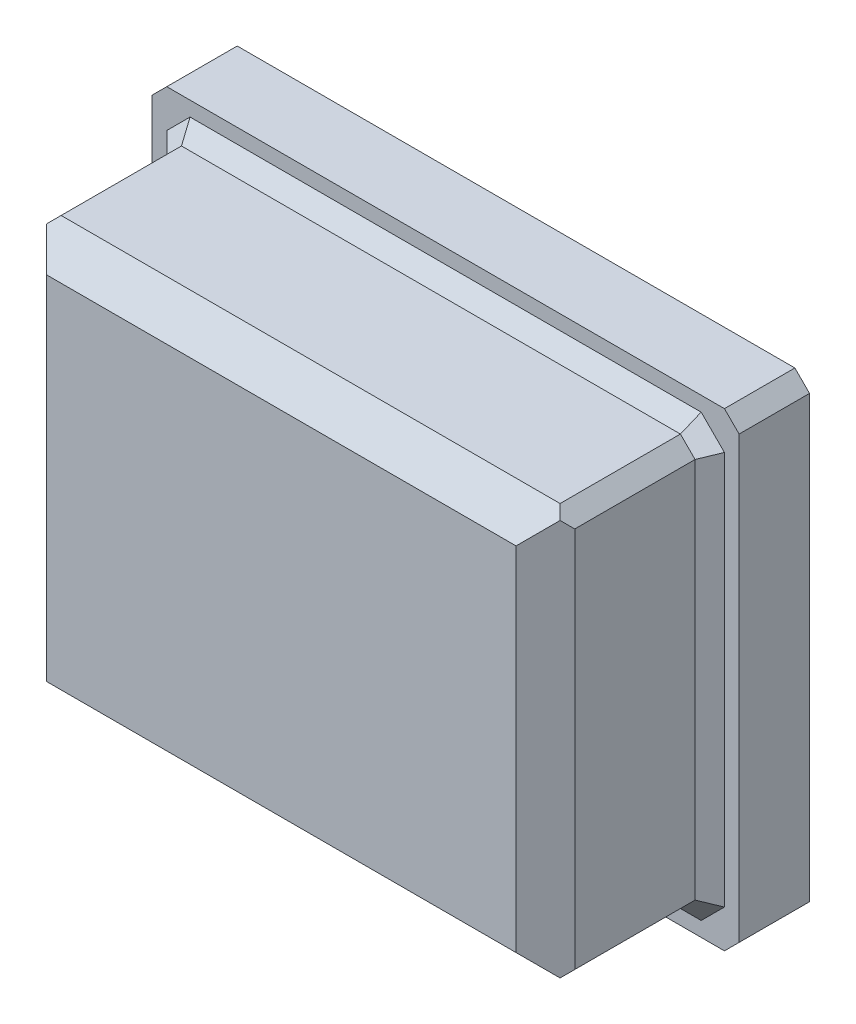
ISO-10303-21;
HEADER;
FILE_DESCRIPTION(('STEP AP214'),'2;1');
FILE_NAME('part.step','',(''),(''),'','','');
FILE_SCHEMA(('AUTOMOTIVE_DESIGN { 1 0 10303 214 1 1 1 1 }'));
ENDSEC;
DATA;
#1=APPLICATION_CONTEXT('core data for automotive mechanical design processes');
#2=APPLICATION_PROTOCOL_DEFINITION('international standard','automotive_design',2000,#1);
#3=PRODUCT_CONTEXT('',#1,'mechanical');
#4=PRODUCT('Part','Part','',(#3));
#5=PRODUCT_RELATED_PRODUCT_CATEGORY('part','',(#4));
#6=PRODUCT_DEFINITION_FORMATION('','',#4);
#7=PRODUCT_DEFINITION_CONTEXT('part definition',#1,'design');
#8=PRODUCT_DEFINITION('design','',#6,#7);
#9=PRODUCT_DEFINITION_SHAPE('','',#8);
#10=(LENGTH_UNIT() NAMED_UNIT(*) SI_UNIT(.MILLI.,.METRE.));
#11=(NAMED_UNIT(*) PLANE_ANGLE_UNIT() SI_UNIT($,.RADIAN.));
#12=(NAMED_UNIT(*) SI_UNIT($,.STERADIAN.) SOLID_ANGLE_UNIT());
#13=UNCERTAINTY_MEASURE_WITH_UNIT(LENGTH_MEASURE(1.E-05),#10,'distance_accuracy_value','');
#14=(GEOMETRIC_REPRESENTATION_CONTEXT(3) GLOBAL_UNCERTAINTY_ASSIGNED_CONTEXT((#13)) GLOBAL_UNIT_ASSIGNED_CONTEXT((#10,
#11,#12)) REPRESENTATION_CONTEXT('',''));
#15=CARTESIAN_POINT('',(0.,0.,0.));
#16=DIRECTION('',(0.,0.,1.));
#17=DIRECTION('',(1.,0.,0.));
#18=AXIS2_PLACEMENT_3D('',#15,#16,#17);
#19=CARTESIAN_POINT('',(0.,0.,0.24));
#20=DIRECTION('',(0.,0.,-1.));
#21=DIRECTION('',(-1.,0.,0.));
#22=AXIS2_PLACEMENT_3D('',#19,#20,#21);
#23=PLANE('',#22);
#24=DIRECTION('',(0.,1.,0.));
#25=VECTOR('',#24,1.);
#26=CARTESIAN_POINT('',(-1.31380952380952,0.737619047619048,0.24));
#27=LINE('',#26,#25);
#28=CARTESIAN_POINT('',(-1.31380952380952,-0.583091630499607,0.24));
#29=VERTEX_POINT('',#28);
#30=CARTESIAN_POINT('',(-1.31380952380952,0.758329725737702,0.24));
#31=VERTEX_POINT('',#30);
#32=EDGE_CURVE('E308',#29,#31,#27,.T.);
#33=ORIENTED_EDGE('',*,*,#32,.T.);
#34=DIRECTION('',(0.707106781186547,0.707106781186548,0.));
#35=VECTOR('',#34,1.);
#36=CARTESIAN_POINT('',(-1.24916486286885,0.822974386678375,0.24));
#37=LINE('',#36,#35);
#38=CARTESIAN_POINT('',(-1.23452020192818,0.837619047619048,0.24));
#39=VERTEX_POINT('',#38);
#40=EDGE_CURVE('E329',#31,#39,#37,.T.);
#41=ORIENTED_EDGE('',*,*,#40,.T.);
#42=DIRECTION('',(1.,0.,0.));
#43=VECTOR('',#42,1.);
#44=CARTESIAN_POINT('',(0.486190476190475,0.837619047619048,0.24));
#45=LINE('',#44,#43);
#46=CARTESIAN_POINT('',(0.50690115430913,0.837619047619048,0.24));
#47=VERTEX_POINT('',#46);
#48=EDGE_CURVE('E326',#39,#47,#45,.T.);
#49=ORIENTED_EDGE('',*,*,#48,.T.);
#50=DIRECTION('',(0.707106781186548,-0.707106781186548,0.));
#51=VECTOR('',#50,1.);
#52=CARTESIAN_POINT('',(0.571545815249802,0.772974386678375,0.24));
#53=LINE('',#52,#51);
#54=CARTESIAN_POINT('',(0.586190476190475,0.758329725737702,0.24));
#55=VERTEX_POINT('',#54);
#56=EDGE_CURVE('E323',#47,#55,#53,.T.);
#57=ORIENTED_EDGE('',*,*,#56,.T.);
#58=DIRECTION('',(0.,-1.,0.));
#59=VECTOR('',#58,1.);
#60=CARTESIAN_POINT('',(0.586190476190475,-0.562380952380952,0.24));
#61=LINE('',#60,#59);
#62=CARTESIAN_POINT('',(0.586190476190475,-0.583091630499607,0.24));
#63=VERTEX_POINT('',#62);
#64=EDGE_CURVE('E320',#55,#63,#61,.T.);
#65=ORIENTED_EDGE('',*,*,#64,.T.);
#66=DIRECTION('',(-0.707106781186548,-0.707106781186548,0.));
#67=VECTOR('',#66,1.);
#68=CARTESIAN_POINT('',(0.521545815249803,-0.647736291440279,0.24));
#69=LINE('',#68,#67);
#70=CARTESIAN_POINT('',(0.50690115430913,-0.662380952380952,0.24));
#71=VERTEX_POINT('',#70);
#72=EDGE_CURVE('E317',#63,#71,#69,.T.);
#73=ORIENTED_EDGE('',*,*,#72,.T.);
#74=DIRECTION('',(-1.,0.,0.));
#75=VECTOR('',#74,1.);
#76=CARTESIAN_POINT('',(-1.21380952380952,-0.662380952380952,0.24));
#77=LINE('',#76,#75);
#78=CARTESIAN_POINT('',(-1.23452020192818,-0.662380952380952,0.24));
#79=VERTEX_POINT('',#78);
#80=EDGE_CURVE('E314',#71,#79,#77,.T.);
#81=ORIENTED_EDGE('',*,*,#80,.T.);
#82=DIRECTION('',(-0.707106781186547,0.707106781186548,0.));
#83=VECTOR('',#82,1.);
#84=CARTESIAN_POINT('',(-1.29916486286885,-0.597736291440279,0.24));
#85=LINE('',#84,#83);
#86=EDGE_CURVE('E311',#79,#29,#85,.T.);
#87=ORIENTED_EDGE('',*,*,#86,.T.);
#88=EDGE_LOOP('',(#33,#41,#49,#57,#65,#73,#81,#87));
#89=FACE_BOUND('',#88,.T.);
#90=DIRECTION('',(-1.,0.,0.));
#91=VECTOR('',#90,1.);
#92=CARTESIAN_POINT('',(-1.31380952380952,0.887619047619048,0.24));
#93=LINE('',#92,#91);
#94=CARTESIAN_POINT('',(0.586190476190475,0.887619047619048,0.24));
#95=VERTEX_POINT('',#94);
#96=CARTESIAN_POINT('',(-1.31380952380952,0.887619047619048,0.24));
#97=VERTEX_POINT('',#96);
#98=EDGE_CURVE('E217',#95,#97,#93,.T.);
#99=ORIENTED_EDGE('',*,*,#98,.T.);
#100=DIRECTION('',(-0.707106781186547,-0.707106781186548,0.));
#101=VECTOR('',#100,1.);
#102=CARTESIAN_POINT('',(-1.36380952380952,0.837619047619048,0.24));
#103=LINE('',#102,#101);
#104=CARTESIAN_POINT('',(-1.36380952380952,0.837619047619048,0.24));
#105=VERTEX_POINT('',#104);
#106=EDGE_CURVE('E205',#97,#105,#103,.T.);
#107=ORIENTED_EDGE('',*,*,#106,.T.);
#108=DIRECTION('',(0.,-1.,0.));
#109=VECTOR('',#108,1.);
#110=CARTESIAN_POINT('',(-1.36380952380952,0.837619047619048,0.24));
#111=LINE('',#110,#109);
#112=CARTESIAN_POINT('',(-1.36380952380952,-0.662380952380952,0.24));
#113=VERTEX_POINT('',#112);
#114=EDGE_CURVE('E216',#105,#113,#111,.T.);
#115=ORIENTED_EDGE('',*,*,#114,.T.);
#116=DIRECTION('',(0.707106781186547,-0.707106781186548,0.));
#117=VECTOR('',#116,1.);
#118=CARTESIAN_POINT('',(-1.36380952380952,-0.662380952380952,0.24));
#119=LINE('',#118,#117);
#120=CARTESIAN_POINT('',(-1.31380952380952,-0.712380952380952,0.24));
#121=VERTEX_POINT('',#120);
#122=EDGE_CURVE('E427',#113,#121,#119,.T.);
#123=ORIENTED_EDGE('',*,*,#122,.T.);
#124=DIRECTION('',(1.,0.,0.));
#125=VECTOR('',#124,1.);
#126=CARTESIAN_POINT('',(-1.31380952380952,-0.712380952380952,0.24));
#127=LINE('',#126,#125);
#128=CARTESIAN_POINT('',(0.586190476190475,-0.712380952380952,0.24));
#129=VERTEX_POINT('',#128);
#130=EDGE_CURVE('E430',#121,#129,#127,.T.);
#131=ORIENTED_EDGE('',*,*,#130,.T.);
#132=DIRECTION('',(0.707106781186548,0.707106781186548,0.));
#133=VECTOR('',#132,1.);
#134=CARTESIAN_POINT('',(0.586190476190475,-0.712380952380952,0.24));
#135=LINE('',#134,#133);
#136=CARTESIAN_POINT('',(0.636190476190475,-0.662380952380952,0.24));
#137=VERTEX_POINT('',#136);
#138=EDGE_CURVE('E433',#129,#137,#135,.T.);
#139=ORIENTED_EDGE('',*,*,#138,.T.);
#140=DIRECTION('',(0.,1.,0.));
#141=VECTOR('',#140,1.);
#142=CARTESIAN_POINT('',(0.636190476190475,0.837619047619048,0.24));
#143=LINE('',#142,#141);
#144=CARTESIAN_POINT('',(0.636190476190475,0.837619047619048,0.24));
#145=VERTEX_POINT('',#144);
#146=EDGE_CURVE('E436',#137,#145,#143,.T.);
#147=ORIENTED_EDGE('',*,*,#146,.T.);
#148=DIRECTION('',(-0.707106781186548,0.707106781186548,0.));
#149=VECTOR('',#148,1.);
#150=CARTESIAN_POINT('',(0.586190476190475,0.887619047619048,0.24));
#151=LINE('',#150,#149);
#152=EDGE_CURVE('E221',#145,#95,#151,.T.);
#153=ORIENTED_EDGE('',*,*,#152,.T.);
#154=EDGE_LOOP('',(#99,#107,#115,#123,#131,#139,#147,#153));
#155=FACE_BOUND('',#154,.T.);
#156=ADVANCED_FACE('F41',(#89,#155),#23,.F.);
#157=CARTESIAN_POINT('',(-1.31380952380952,0.887619047619048,0.24));
#158=DIRECTION('',(0.,-1.,0.));
#159=DIRECTION('',(1.,0.,0.));
#160=AXIS2_PLACEMENT_3D('',#157,#158,#159);
#161=PLANE('',#160);
#162=DIRECTION('',(-1.,0.,0.));
#163=VECTOR('',#162,1.);
#164=CARTESIAN_POINT('',(-1.31380952380952,0.887619047619048,0.));
#165=LINE('',#164,#163);
#166=CARTESIAN_POINT('',(0.586190476190475,0.887619047619048,0.));
#167=VERTEX_POINT('',#166);
#168=CARTESIAN_POINT('',(-1.31380952380952,0.887619047619048,0.));
#169=VERTEX_POINT('',#168);
#170=EDGE_CURVE('E230',#167,#169,#165,.T.);
#171=ORIENTED_EDGE('',*,*,#170,.T.);
#172=DIRECTION('',(0.,0.,-1.));
#173=VECTOR('',#172,1.);
#174=CARTESIAN_POINT('',(-1.31380952380952,0.887619047619048,0.24));
#175=LINE('',#174,#173);
#176=EDGE_CURVE('E209',#97,#169,#175,.T.);
#177=ORIENTED_EDGE('',*,*,#176,.F.);
#178=ORIENTED_EDGE('',*,*,#98,.F.);
#179=DIRECTION('',(0.,0.,-1.));
#180=VECTOR('',#179,1.);
#181=CARTESIAN_POINT('',(0.586190476190475,0.887619047619048,0.24));
#182=LINE('',#181,#180);
#183=EDGE_CURVE('E440',#95,#167,#182,.T.);
#184=ORIENTED_EDGE('',*,*,#183,.T.);
#185=EDGE_LOOP('',(#171,#177,#178,#184));
#186=FACE_BOUND('',#185,.T.);
#187=ADVANCED_FACE('F228',(#186),#161,.F.);
#188=CARTESIAN_POINT('',(-1.36380952380952,0.837619047619048,0.24));
#189=DIRECTION('',(0.707106781186548,-0.707106781186547,0.));
#190=DIRECTION('',(0.707106781186547,0.707106781186548,0.));
#191=AXIS2_PLACEMENT_3D('',#188,#189,#190);
#192=PLANE('',#191);
#193=DIRECTION('',(-0.707106781186547,-0.707106781186548,0.));
#194=VECTOR('',#193,1.);
#195=CARTESIAN_POINT('',(-1.36380952380952,0.837619047619048,0.));
#196=LINE('',#195,#194);
#197=CARTESIAN_POINT('',(-1.36380952380952,0.837619047619048,0.));
#198=VERTEX_POINT('',#197);
#199=EDGE_CURVE('E419',#169,#198,#196,.T.);
#200=ORIENTED_EDGE('',*,*,#199,.T.);
#201=DIRECTION('',(0.,0.,-1.));
#202=VECTOR('',#201,1.);
#203=CARTESIAN_POINT('',(-1.36380952380952,0.837619047619048,0.24));
#204=LINE('',#203,#202);
#205=EDGE_CURVE('E212',#105,#198,#204,.T.);
#206=ORIENTED_EDGE('',*,*,#205,.F.);
#207=ORIENTED_EDGE('',*,*,#106,.F.);
#208=ORIENTED_EDGE('',*,*,#176,.T.);
#209=EDGE_LOOP('',(#200,#206,#207,#208));
#210=FACE_BOUND('',#209,.T.);
#211=ADVANCED_FACE('F207',(#210),#192,.F.);
#212=CARTESIAN_POINT('',(-1.36380952380952,0.837619047619048,0.24));
#213=DIRECTION('',(1.,0.,0.));
#214=DIRECTION('',(0.,0.,-1.));
#215=AXIS2_PLACEMENT_3D('',#212,#213,#214);
#216=PLANE('',#215);
#217=DIRECTION('',(0.,-1.,0.));
#218=VECTOR('',#217,1.);
#219=CARTESIAN_POINT('',(-1.36380952380952,0.837619047619048,0.));
#220=LINE('',#219,#218);
#221=CARTESIAN_POINT('',(-1.36380952380952,-0.662380952380952,0.));
#222=VERTEX_POINT('',#221);
#223=EDGE_CURVE('E444',#198,#222,#220,.T.);
#224=ORIENTED_EDGE('',*,*,#223,.T.);
#225=DIRECTION('',(0.,0.,-1.));
#226=VECTOR('',#225,1.);
#227=CARTESIAN_POINT('',(-1.36380952380952,-0.662380952380952,0.24));
#228=LINE('',#227,#226);
#229=EDGE_CURVE('E238',#113,#222,#228,.T.);
#230=ORIENTED_EDGE('',*,*,#229,.F.);
#231=ORIENTED_EDGE('',*,*,#114,.F.);
#232=ORIENTED_EDGE('',*,*,#205,.T.);
#233=EDGE_LOOP('',(#224,#230,#231,#232));
#234=FACE_BOUND('',#233,.T.);
#235=ADVANCED_FACE('F503',(#234),#216,.F.);
#236=CARTESIAN_POINT('',(-1.36380952380952,-0.662380952380952,0.24));
#237=DIRECTION('',(0.707106781186548,0.707106781186547,0.));
#238=DIRECTION('',(-0.707106781186547,0.707106781186548,0.));
#239=AXIS2_PLACEMENT_3D('',#236,#237,#238);
#240=PLANE('',#239);
#241=DIRECTION('',(0.707106781186547,-0.707106781186548,0.));
#242=VECTOR('',#241,1.);
#243=CARTESIAN_POINT('',(-1.36380952380952,-0.662380952380952,0.));
#244=LINE('',#243,#242);
#245=CARTESIAN_POINT('',(-1.31380952380952,-0.712380952380952,0.));
#246=VERTEX_POINT('',#245);
#247=EDGE_CURVE('E447',#222,#246,#244,.T.);
#248=ORIENTED_EDGE('',*,*,#247,.T.);
#249=DIRECTION('',(0.,0.,-1.));
#250=VECTOR('',#249,1.);
#251=CARTESIAN_POINT('',(-1.31380952380952,-0.712380952380952,0.24));
#252=LINE('',#251,#250);
#253=EDGE_CURVE('E475',#121,#246,#252,.T.);
#254=ORIENTED_EDGE('',*,*,#253,.F.);
#255=ORIENTED_EDGE('',*,*,#122,.F.);
#256=ORIENTED_EDGE('',*,*,#229,.T.);
#257=EDGE_LOOP('',(#248,#254,#255,#256));
#258=FACE_BOUND('',#257,.T.);
#259=ADVANCED_FACE('F484',(#258),#240,.F.);
#260=CARTESIAN_POINT('',(-1.31380952380952,-0.712380952380952,0.24));
#261=DIRECTION('',(0.,1.,0.));
#262=DIRECTION('',(0.,0.,1.));
#263=AXIS2_PLACEMENT_3D('',#260,#261,#262);
#264=PLANE('',#263);
#265=DIRECTION('',(1.,0.,0.));
#266=VECTOR('',#265,1.);
#267=CARTESIAN_POINT('',(-1.31380952380952,-0.712380952380952,0.));
#268=LINE('',#267,#266);
#269=CARTESIAN_POINT('',(0.586190476190475,-0.712380952380952,0.));
#270=VERTEX_POINT('',#269);
#271=EDGE_CURVE('E450',#246,#270,#268,.T.);
#272=ORIENTED_EDGE('',*,*,#271,.T.);
#273=DIRECTION('',(0.,0.,-1.));
#274=VECTOR('',#273,1.);
#275=CARTESIAN_POINT('',(0.586190476190475,-0.712380952380952,0.24));
#276=LINE('',#275,#274);
#277=EDGE_CURVE('E471',#129,#270,#276,.T.);
#278=ORIENTED_EDGE('',*,*,#277,.F.);
#279=ORIENTED_EDGE('',*,*,#130,.F.);
#280=ORIENTED_EDGE('',*,*,#253,.T.);
#281=EDGE_LOOP('',(#272,#278,#279,#280));
#282=FACE_BOUND('',#281,.T.);
#283=ADVANCED_FACE('F495',(#282),#264,.F.);
#284=CARTESIAN_POINT('',(0.586190476190475,-0.712380952380952,0.24));
#285=DIRECTION('',(-0.707106781186548,0.707106781186548,0.));
#286=DIRECTION('',(-0.707106781186548,-0.707106781186548,0.));
#287=AXIS2_PLACEMENT_3D('',#284,#285,#286);
#288=PLANE('',#287);
#289=DIRECTION('',(0.707106781186548,0.707106781186548,0.));
#290=VECTOR('',#289,1.);
#291=CARTESIAN_POINT('',(0.586190476190475,-0.712380952380952,0.));
#292=LINE('',#291,#290);
#293=CARTESIAN_POINT('',(0.636190476190475,-0.662380952380952,0.));
#294=VERTEX_POINT('',#293);
#295=EDGE_CURVE('E453',#270,#294,#292,.T.);
#296=ORIENTED_EDGE('',*,*,#295,.T.);
#297=DIRECTION('',(0.,0.,-1.));
#298=VECTOR('',#297,1.);
#299=CARTESIAN_POINT('',(0.636190476190475,-0.662380952380952,0.24));
#300=LINE('',#299,#298);
#301=EDGE_CURVE('E467',#137,#294,#300,.T.);
#302=ORIENTED_EDGE('',*,*,#301,.F.);
#303=ORIENTED_EDGE('',*,*,#138,.F.);
#304=ORIENTED_EDGE('',*,*,#277,.T.);
#305=EDGE_LOOP('',(#296,#302,#303,#304));
#306=FACE_BOUND('',#305,.T.);
#307=ADVANCED_FACE('F499',(#306),#288,.F.);
#308=CARTESIAN_POINT('',(0.636190476190475,0.837619047619048,0.24));
#309=DIRECTION('',(-1.,0.,0.));
#310=DIRECTION('',(0.,0.,1.));
#311=AXIS2_PLACEMENT_3D('',#308,#309,#310);
#312=PLANE('',#311);
#313=DIRECTION('',(0.,1.,0.));
#314=VECTOR('',#313,1.);
#315=CARTESIAN_POINT('',(0.636190476190475,0.837619047619048,0.));
#316=LINE('',#315,#314);
#317=CARTESIAN_POINT('',(0.636190476190475,0.837619047619048,0.));
#318=VERTEX_POINT('',#317);
#319=EDGE_CURVE('E456',#294,#318,#316,.T.);
#320=ORIENTED_EDGE('',*,*,#319,.T.);
#321=DIRECTION('',(0.,0.,-1.));
#322=VECTOR('',#321,1.);
#323=CARTESIAN_POINT('',(0.636190476190475,0.837619047619048,0.24));
#324=LINE('',#323,#322);
#325=EDGE_CURVE('E463',#145,#318,#324,.T.);
#326=ORIENTED_EDGE('',*,*,#325,.F.);
#327=ORIENTED_EDGE('',*,*,#146,.F.);
#328=ORIENTED_EDGE('',*,*,#301,.T.);
#329=EDGE_LOOP('',(#320,#326,#327,#328));
#330=FACE_BOUND('',#329,.T.);
#331=ADVANCED_FACE('F526',(#330),#312,.F.);
#332=CARTESIAN_POINT('',(0.586190476190475,0.887619047619048,0.24));
#333=DIRECTION('',(-0.707106781186548,-0.707106781186548,0.));
#334=DIRECTION('',(0.707106781186548,-0.707106781186548,0.));
#335=AXIS2_PLACEMENT_3D('',#332,#333,#334);
#336=PLANE('',#335);
#337=DIRECTION('',(-0.707106781186548,0.707106781186548,0.));
#338=VECTOR('',#337,1.);
#339=CARTESIAN_POINT('',(0.586190476190475,0.887619047619048,0.));
#340=LINE('',#339,#338);
#341=EDGE_CURVE('E226',#318,#167,#340,.T.);
#342=ORIENTED_EDGE('',*,*,#341,.T.);
#343=ORIENTED_EDGE('',*,*,#183,.F.);
#344=ORIENTED_EDGE('',*,*,#152,.F.);
#345=ORIENTED_EDGE('',*,*,#325,.T.);
#346=EDGE_LOOP('',(#342,#343,#344,#345));
#347=FACE_BOUND('',#346,.T.);
#348=ADVANCED_FACE('F523',(#347),#336,.F.);
#349=CARTESIAN_POINT('',(0.,0.,0.));
#350=DIRECTION('',(0.,0.,-1.));
#351=DIRECTION('',(-1.,0.,0.));
#352=AXIS2_PLACEMENT_3D('',#349,#350,#351);
#353=PLANE('',#352);
#354=ORIENTED_EDGE('',*,*,#170,.F.);
#355=ORIENTED_EDGE('',*,*,#341,.F.);
#356=ORIENTED_EDGE('',*,*,#319,.F.);
#357=ORIENTED_EDGE('',*,*,#295,.F.);
#358=ORIENTED_EDGE('',*,*,#271,.F.);
#359=ORIENTED_EDGE('',*,*,#247,.F.);
#360=ORIENTED_EDGE('',*,*,#223,.F.);
#361=ORIENTED_EDGE('',*,*,#199,.F.);
#362=EDGE_LOOP('',(#354,#355,#356,#357,#358,#359,#360,#361));
#363=FACE_BOUND('',#362,.T.);
#364=ADVANCED_FACE('F490',(#363),#353,.T.);
#365=CARTESIAN_POINT('',(-1.21380952380952,0.787619047619048,0.8));
#366=DIRECTION('',(0.,-1.,0.));
#367=DIRECTION('',(0.,0.,-1.));
#368=AXIS2_PLACEMENT_3D('',#365,#366,#367);
#369=PLANE('',#368);
#370=DIRECTION('',(0.,0.,-1.));
#371=VECTOR('',#370,1.);
#372=CARTESIAN_POINT('',(0.486190476190475,0.787619047619048,0.8));
#373=LINE('',#372,#371);
#374=CARTESIAN_POINT('',(0.486190476190475,0.787619047619048,0.7));
#375=VERTEX_POINT('',#374);
#376=CARTESIAN_POINT('',(0.486190476190475,0.787619047619048,0.29));
#377=VERTEX_POINT('',#376);
#378=EDGE_CURVE('E304',#375,#377,#373,.T.);
#379=ORIENTED_EDGE('',*,*,#378,.T.);
#380=DIRECTION('',(-1.,0.,0.));
#381=VECTOR('',#380,1.);
#382=CARTESIAN_POINT('',(-1.21380952380952,0.787619047619048,0.29));
#383=LINE('',#382,#381);
#384=CARTESIAN_POINT('',(-1.21380952380952,0.787619047619048,0.29));
#385=VERTEX_POINT('',#384);
#386=EDGE_CURVE('E333',#377,#385,#383,.T.);
#387=ORIENTED_EDGE('',*,*,#386,.T.);
#388=DIRECTION('',(0.,0.,-1.));
#389=VECTOR('',#388,1.);
#390=CARTESIAN_POINT('',(-1.21380952380952,0.787619047619048,0.8));
#391=LINE('',#390,#389);
#392=CARTESIAN_POINT('',(-1.21380952380952,0.787619047619048,0.7));
#393=VERTEX_POINT('',#392);
#394=EDGE_CURVE('E407',#393,#385,#391,.T.);
#395=ORIENTED_EDGE('',*,*,#394,.F.);
#396=DIRECTION('',(1.,0.,0.));
#397=VECTOR('',#396,1.);
#398=CARTESIAN_POINT('',(-1.21380952380952,0.787619047619048,0.7));
#399=LINE('',#398,#397);
#400=EDGE_CURVE('E257',#393,#375,#399,.T.);
#401=ORIENTED_EDGE('',*,*,#400,.T.);
#402=EDGE_LOOP('',(#379,#387,#395,#401));
#403=FACE_BOUND('',#402,.T.);
#404=ADVANCED_FACE('F406',(#403),#369,.F.);
#405=CARTESIAN_POINT('',(-1.26380952380952,0.737619047619048,0.8));
#406=DIRECTION('',(0.707106781186548,-0.707106781186547,0.));
#407=DIRECTION('',(0.707106781186547,0.707106781186548,0.));
#408=AXIS2_PLACEMENT_3D('',#405,#406,#407);
#409=PLANE('',#408);
#410=ORIENTED_EDGE('',*,*,#394,.T.);
#411=DIRECTION('',(-0.707106781186547,-0.707106781186548,0.));
#412=VECTOR('',#411,1.);
#413=CARTESIAN_POINT('',(-1.26380952380952,0.737619047619048,0.29));
#414=LINE('',#413,#412);
#415=CARTESIAN_POINT('',(-1.26380952380952,0.737619047619048,0.29));
#416=VERTEX_POINT('',#415);
#417=EDGE_CURVE('E288',#385,#416,#414,.T.);
#418=ORIENTED_EDGE('',*,*,#417,.T.);
#419=DIRECTION('',(0.,0.,-1.));
#420=VECTOR('',#419,1.);
#421=CARTESIAN_POINT('',(-1.26380952380952,0.737619047619048,0.8));
#422=LINE('',#421,#420);
#423=CARTESIAN_POINT('',(-1.26380952380952,0.737619047619048,0.7));
#424=VERTEX_POINT('',#423);
#425=EDGE_CURVE('E415',#424,#416,#422,.T.);
#426=ORIENTED_EDGE('',*,*,#425,.F.);
#427=DIRECTION('',(-0.577350269189625,-0.577350269189626,-0.577350269189626));
#428=VECTOR('',#427,1.);
#429=CARTESIAN_POINT('',(-1.44301587301587,0.558412698412698,0.52079365079365));
#430=LINE('',#429,#428);
#431=CARTESIAN_POINT('',(-1.23880952380952,0.762619047619048,0.725));
#432=VERTEX_POINT('',#431);
#433=EDGE_CURVE('E251',#424,#432,#430,.F.);
#434=ORIENTED_EDGE('',*,*,#433,.T.);
#435=DIRECTION('',(-0.577350269189624,-0.577350269189625,0.577350269189628));
#436=VECTOR('',#435,1.);
#437=CARTESIAN_POINT('',(-0.875873015873018,1.12555555555555,0.362063492063492));
#438=LINE('',#437,#436);
#439=EDGE_CURVE('E254',#432,#393,#438,.F.);
#440=ORIENTED_EDGE('',*,*,#439,.T.);
#441=EDGE_LOOP('',(#410,#418,#426,#434,#440));
#442=FACE_BOUND('',#441,.T.);
#443=ADVANCED_FACE('F411',(#442),#409,.F.);
#444=CARTESIAN_POINT('',(-1.26380952380952,0.737619047619048,0.8));
#445=DIRECTION('',(1.,0.,0.));
#446=DIRECTION('',(0.,1.,0.));
#447=AXIS2_PLACEMENT_3D('',#444,#445,#446);
#448=PLANE('',#447);
#449=ORIENTED_EDGE('',*,*,#425,.T.);
#450=DIRECTION('',(0.,-1.,0.));
#451=VECTOR('',#450,1.);
#452=CARTESIAN_POINT('',(-1.26380952380952,-0.562380952380952,0.29));
#453=LINE('',#452,#451);
#454=CARTESIAN_POINT('',(-1.26380952380952,-0.562380952380952,0.29));
#455=VERTEX_POINT('',#454);
#456=EDGE_CURVE('E11',#416,#455,#453,.T.);
#457=ORIENTED_EDGE('',*,*,#456,.T.);
#458=DIRECTION('',(0.,0.,-1.));
#459=VECTOR('',#458,1.);
#460=CARTESIAN_POINT('',(-1.26380952380952,-0.562380952380952,0.8));
#461=LINE('',#460,#459);
#462=CARTESIAN_POINT('',(-1.26380952380952,-0.562380952380952,0.7));
#463=VERTEX_POINT('',#462);
#464=EDGE_CURVE('E421',#463,#455,#461,.T.);
#465=ORIENTED_EDGE('',*,*,#464,.F.);
#466=DIRECTION('',(0.,1.,0.));
#467=VECTOR('',#466,1.);
#468=CARTESIAN_POINT('',(-1.26380952380952,0.737619047619048,0.7));
#469=LINE('',#468,#467);
#470=EDGE_CURVE('E285',#463,#424,#469,.T.);
#471=ORIENTED_EDGE('',*,*,#470,.T.);
#472=EDGE_LOOP('',(#449,#457,#465,#471));
#473=FACE_BOUND('',#472,.T.);
#474=ADVANCED_FACE('F568',(#473),#448,.F.);
#475=CARTESIAN_POINT('',(-1.26380952380952,-0.562380952380952,0.8));
#476=DIRECTION('',(0.707106781186548,0.707106781186547,0.));
#477=DIRECTION('',(-0.707106781186547,0.707106781186548,0.));
#478=AXIS2_PLACEMENT_3D('',#475,#476,#477);
#479=PLANE('',#478);
#480=ORIENTED_EDGE('',*,*,#464,.T.);
#481=DIRECTION('',(0.707106781186547,-0.707106781186548,0.));
#482=VECTOR('',#481,1.);
#483=CARTESIAN_POINT('',(-1.21380952380952,-0.612380952380952,0.29));
#484=LINE('',#483,#482);
#485=CARTESIAN_POINT('',(-1.21380952380952,-0.612380952380952,0.29));
#486=VERTEX_POINT('',#485);
#487=EDGE_CURVE('E51',#455,#486,#484,.T.);
#488=ORIENTED_EDGE('',*,*,#487,.T.);
#489=DIRECTION('',(0.,0.,-1.));
#490=VECTOR('',#489,1.);
#491=CARTESIAN_POINT('',(-1.21380952380952,-0.612380952380952,0.8));
#492=LINE('',#491,#490);
#493=CARTESIAN_POINT('',(-1.21380952380952,-0.612380952380952,0.7));
#494=VERTEX_POINT('',#493);
#495=EDGE_CURVE('E832',#494,#486,#492,.T.);
#496=ORIENTED_EDGE('',*,*,#495,.F.);
#497=DIRECTION('',(0.577350269189624,-0.577350269189625,-0.577350269189628));
#498=VECTOR('',#497,1.);
#499=CARTESIAN_POINT('',(-0.875873015873018,-0.950317460317459,0.362063492063492));
#500=LINE('',#499,#498);
#501=CARTESIAN_POINT('',(-1.23880952380952,-0.587380952380952,0.725));
#502=VERTEX_POINT('',#501);
#503=EDGE_CURVE('E282',#494,#502,#500,.F.);
#504=ORIENTED_EDGE('',*,*,#503,.T.);
#505=DIRECTION('',(0.577350269189625,-0.577350269189626,0.577350269189626));
#506=VECTOR('',#505,1.);
#507=CARTESIAN_POINT('',(-1.38460317460317,-0.441587301587301,0.579206349206349));
#508=LINE('',#507,#506);
#509=EDGE_CURVE('E279',#502,#463,#508,.F.);
#510=ORIENTED_EDGE('',*,*,#509,.T.);
#511=EDGE_LOOP('',(#480,#488,#496,#504,#510));
#512=FACE_BOUND('',#511,.T.);
#513=ADVANCED_FACE('F574',(#512),#479,.F.);
#514=CARTESIAN_POINT('',(-1.21380952380952,-0.612380952380952,0.8));
#515=DIRECTION('',(0.,1.,0.));
#516=DIRECTION('',(0.,0.,1.));
#517=AXIS2_PLACEMENT_3D('',#514,#515,#516);
#518=PLANE('',#517);
#519=ORIENTED_EDGE('',*,*,#495,.T.);
#520=DIRECTION('',(1.,0.,0.));
#521=VECTOR('',#520,1.);
#522=CARTESIAN_POINT('',(0.486190476190475,-0.612380952380952,0.29));
#523=LINE('',#522,#521);
#524=CARTESIAN_POINT('',(0.486190476190475,-0.612380952380952,0.29));
#525=VERTEX_POINT('',#524);
#526=EDGE_CURVE('E345',#486,#525,#523,.T.);
#527=ORIENTED_EDGE('',*,*,#526,.T.);
#528=DIRECTION('',(0.,0.,-1.));
#529=VECTOR('',#528,1.);
#530=CARTESIAN_POINT('',(0.486190476190475,-0.612380952380952,0.8));
#531=LINE('',#530,#529);
#532=CARTESIAN_POINT('',(0.486190476190475,-0.612380952380952,0.7));
#533=VERTEX_POINT('',#532);
#534=EDGE_CURVE('E830',#533,#525,#531,.T.);
#535=ORIENTED_EDGE('',*,*,#534,.F.);
#536=DIRECTION('',(-1.,0.,0.));
#537=VECTOR('',#536,1.);
#538=CARTESIAN_POINT('',(-1.21380952380952,-0.612380952380952,0.7));
#539=LINE('',#538,#537);
#540=EDGE_CURVE('E276',#533,#494,#539,.T.);
#541=ORIENTED_EDGE('',*,*,#540,.T.);
#542=EDGE_LOOP('',(#519,#527,#535,#541));
#543=FACE_BOUND('',#542,.T.);
#544=ADVANCED_FACE('F582',(#543),#518,.F.);
#545=CARTESIAN_POINT('',(0.486190476190475,-0.612380952380952,0.8));
#546=DIRECTION('',(-0.707106781186548,0.707106781186548,0.));
#547=DIRECTION('',(-0.707106781186548,-0.707106781186548,0.));
#548=AXIS2_PLACEMENT_3D('',#545,#546,#547);
#549=PLANE('',#548);
#550=ORIENTED_EDGE('',*,*,#534,.T.);
#551=DIRECTION('',(0.707106781186548,0.707106781186548,0.));
#552=VECTOR('',#551,1.);
#553=CARTESIAN_POINT('',(0.536190476190475,-0.562380952380952,0.29));
#554=LINE('',#553,#552);
#555=CARTESIAN_POINT('',(0.536190476190475,-0.562380952380952,0.29));
#556=VERTEX_POINT('',#555);
#557=EDGE_CURVE('E342',#525,#556,#554,.T.);
#558=ORIENTED_EDGE('',*,*,#557,.T.);
#559=DIRECTION('',(0.,0.,-1.));
#560=VECTOR('',#559,1.);
#561=CARTESIAN_POINT('',(0.536190476190475,-0.562380952380952,0.8));
#562=LINE('',#561,#560);
#563=CARTESIAN_POINT('',(0.536190476190475,-0.562380952380952,0.7));
#564=VERTEX_POINT('',#563);
#565=EDGE_CURVE('E837',#564,#556,#562,.T.);
#566=ORIENTED_EDGE('',*,*,#565,.F.);
#567=DIRECTION('',(0.577350269189625,0.577350269189625,-0.577350269189628));
#568=VECTOR('',#567,1.);
#569=CARTESIAN_POINT('',(0.656984126984126,-0.441587301587302,0.579206349206349));
#570=LINE('',#569,#568);
#571=CARTESIAN_POINT('',(0.511190476190476,-0.587380952380952,0.725));
#572=VERTEX_POINT('',#571);
#573=EDGE_CURVE('E273',#564,#572,#570,.F.);
#574=ORIENTED_EDGE('',*,*,#573,.T.);
#575=DIRECTION('',(0.577350269189625,0.577350269189625,0.577350269189628));
#576=VECTOR('',#575,1.);
#577=CARTESIAN_POINT('',(0.390793650793651,-0.707777777777777,0.604603174603175));
#578=LINE('',#577,#576);
#579=EDGE_CURVE('E270',#572,#533,#578,.F.);
#580=ORIENTED_EDGE('',*,*,#579,.T.);
#581=EDGE_LOOP('',(#550,#558,#566,#574,#580));
#582=FACE_BOUND('',#581,.T.);
#583=ADVANCED_FACE('F590',(#582),#549,.F.);
#584=CARTESIAN_POINT('',(0.536190476190475,0.737619047619048,0.8));
#585=DIRECTION('',(-1.,0.,0.));
#586=DIRECTION('',(0.,-1.,0.));
#587=AXIS2_PLACEMENT_3D('',#584,#585,#586);
#588=PLANE('',#587);
#589=ORIENTED_EDGE('',*,*,#565,.T.);
#590=DIRECTION('',(0.,1.,0.));
#591=VECTOR('',#590,1.);
#592=CARTESIAN_POINT('',(0.536190476190475,0.737619047619048,0.29));
#593=LINE('',#592,#591);
#594=CARTESIAN_POINT('',(0.536190476190475,0.737619047619048,0.29));
#595=VERTEX_POINT('',#594);
#596=EDGE_CURVE('E339',#556,#595,#593,.T.);
#597=ORIENTED_EDGE('',*,*,#596,.T.);
#598=DIRECTION('',(0.,0.,-1.));
#599=VECTOR('',#598,1.);
#600=CARTESIAN_POINT('',(0.536190476190475,0.737619047619048,0.8));
#601=LINE('',#600,#599);
#602=CARTESIAN_POINT('',(0.536190476190475,0.737619047619048,0.7));
#603=VERTEX_POINT('',#602);
#604=EDGE_CURVE('E842',#603,#595,#601,.T.);
#605=ORIENTED_EDGE('',*,*,#604,.F.);
#606=DIRECTION('',(0.,-1.,0.));
#607=VECTOR('',#606,1.);
#608=CARTESIAN_POINT('',(0.536190476190475,0.737619047619048,0.7));
#609=LINE('',#608,#607);
#610=EDGE_CURVE('E267',#603,#564,#609,.T.);
#611=ORIENTED_EDGE('',*,*,#610,.T.);
#612=EDGE_LOOP('',(#589,#597,#605,#611));
#613=FACE_BOUND('',#612,.T.);
#614=ADVANCED_FACE('F599',(#613),#588,.F.);
#615=CARTESIAN_POINT('',(0.486190476190475,0.787619047619048,0.8));
#616=DIRECTION('',(-0.707106781186548,-0.707106781186548,0.));
#617=DIRECTION('',(0.707106781186548,-0.707106781186548,0.));
#618=AXIS2_PLACEMENT_3D('',#615,#616,#617);
#619=PLANE('',#618);
#620=ORIENTED_EDGE('',*,*,#604,.T.);
#621=DIRECTION('',(-0.707106781186548,0.707106781186548,0.));
#622=VECTOR('',#621,1.);
#623=CARTESIAN_POINT('',(0.486190476190475,0.787619047619048,0.29));
#624=LINE('',#623,#622);
#625=EDGE_CURVE('E336',#595,#377,#624,.T.);
#626=ORIENTED_EDGE('',*,*,#625,.T.);
#627=ORIENTED_EDGE('',*,*,#378,.F.);
#628=DIRECTION('',(-0.577350269189625,0.577350269189625,-0.577350269189628));
#629=VECTOR('',#628,1.);
#630=CARTESIAN_POINT('',(0.39079365079365,0.883015873015873,0.604603174603175));
#631=LINE('',#630,#629);
#632=CARTESIAN_POINT('',(0.511190476190475,0.762619047619048,0.725));
#633=VERTEX_POINT('',#632);
#634=EDGE_CURVE('E264',#375,#633,#631,.F.);
#635=ORIENTED_EDGE('',*,*,#634,.T.);
#636=DIRECTION('',(-0.577350269189625,0.577350269189625,0.577350269189627));
#637=VECTOR('',#636,1.);
#638=CARTESIAN_POINT('',(0.715396825396824,0.558412698412699,0.52079365079365));
#639=LINE('',#638,#637);
#640=EDGE_CURVE('E261',#633,#603,#639,.F.);
#641=ORIENTED_EDGE('',*,*,#640,.T.);
#642=EDGE_LOOP('',(#620,#626,#627,#635,#641));
#643=FACE_BOUND('',#642,.T.);
#644=ADVANCED_FACE('F609',(#643),#619,.F.);
#645=CARTESIAN_POINT('',(0.,0.,0.8));
#646=DIRECTION('',(0.,0.,-1.));
#647=DIRECTION('',(-1.,0.,0.));
#648=AXIS2_PLACEMENT_3D('',#645,#646,#647);
#649=PLANE('',#648);
#650=DIRECTION('',(0.,1.,0.));
#651=VECTOR('',#650,1.);
#652=CARTESIAN_POINT('',(0.436190476190476,0.,0.8));
#653=LINE('',#652,#651);
#654=CARTESIAN_POINT('',(0.436190476190476,-0.512380952380953,0.8));
#655=VERTEX_POINT('',#654);
#656=CARTESIAN_POINT('',(0.436190476190476,0.687619047619048,0.8));
#657=VERTEX_POINT('',#656);
#658=EDGE_CURVE('E244',#655,#657,#653,.T.);
#659=ORIENTED_EDGE('',*,*,#658,.T.);
#660=DIRECTION('',(-1.,0.,0.));
#661=VECTOR('',#660,1.);
#662=CARTESIAN_POINT('',(0.,0.687619047619048,0.8));
#663=LINE('',#662,#661);
#664=CARTESIAN_POINT('',(-1.16380952380952,0.687619047619048,0.8));
#665=VERTEX_POINT('',#664);
#666=EDGE_CURVE('E247',#657,#665,#663,.T.);
#667=ORIENTED_EDGE('',*,*,#666,.T.);
#668=DIRECTION('',(0.,-1.,0.));
#669=VECTOR('',#668,1.);
#670=CARTESIAN_POINT('',(-1.16380952380952,0.,0.8));
#671=LINE('',#670,#669);
#672=CARTESIAN_POINT('',(-1.16380952380952,-0.512380952380953,0.8));
#673=VERTEX_POINT('',#672);
#674=EDGE_CURVE('E232',#665,#673,#671,.T.);
#675=ORIENTED_EDGE('',*,*,#674,.T.);
#676=DIRECTION('',(1.,0.,0.));
#677=VECTOR('',#676,1.);
#678=CARTESIAN_POINT('',(0.,-0.512380952380953,0.8));
#679=LINE('',#678,#677);
#680=EDGE_CURVE('E236',#673,#655,#679,.T.);
#681=ORIENTED_EDGE('',*,*,#680,.T.);
#682=EDGE_LOOP('',(#659,#667,#675,#681));
#683=FACE_BOUND('',#682,.T.);
#684=ADVANCED_FACE('F617',(#683),#649,.F.);
#685=CARTESIAN_POINT('',(0.,-0.512380952380953,0.8));
#686=DIRECTION('',(0.,0.707106781186549,-0.707106781186546));
#687=DIRECTION('',(1.,0.,0.));
#688=AXIS2_PLACEMENT_3D('',#685,#686,#687);
#689=PLANE('',#688);
#690=ORIENTED_EDGE('',*,*,#540,.F.);
#691=ORIENTED_EDGE('',*,*,#579,.F.);
#692=DIRECTION('',(-0.577350269189625,0.577350269189625,0.577350269189627));
#693=VECTOR('',#692,1.);
#694=CARTESIAN_POINT('',(0.290793650793651,-0.366984126984128,0.945396825396826));
#695=LINE('',#694,#693);
#696=EDGE_CURVE('E300',#655,#572,#695,.F.);
#697=ORIENTED_EDGE('',*,*,#696,.F.);
#698=ORIENTED_EDGE('',*,*,#680,.F.);
#699=DIRECTION('',(0.577350269189626,0.577350269189624,0.577350269189627));
#700=VECTOR('',#699,1.);
#701=CARTESIAN_POINT('',(-0.993015873015874,-0.341587301587303,0.970793650793651));
#702=LINE('',#701,#700);
#703=EDGE_CURVE('E296',#502,#673,#702,.T.);
#704=ORIENTED_EDGE('',*,*,#703,.F.);
#705=ORIENTED_EDGE('',*,*,#503,.F.);
#706=EDGE_LOOP('',(#690,#691,#697,#698,#704,#705));
#707=FACE_BOUND('',#706,.T.);
#708=ADVANCED_FACE('F625',(#707),#689,.F.);
#709=CARTESIAN_POINT('',(0.436190476190476,0.,0.8));
#710=DIRECTION('',(-0.707106781186549,0.,-0.707106781186546));
#711=DIRECTION('',(0.,1.,0.));
#712=AXIS2_PLACEMENT_3D('',#709,#710,#711);
#713=PLANE('',#712);
#714=ORIENTED_EDGE('',*,*,#610,.F.);
#715=ORIENTED_EDGE('',*,*,#640,.F.);
#716=DIRECTION('',(-0.577350269189625,-0.577350269189625,0.577350269189628));
#717=VECTOR('',#716,1.);
#718=CARTESIAN_POINT('',(0.206984126984127,0.4584126984127,1.02920634920635));
#719=LINE('',#718,#717);
#720=EDGE_CURVE('E292',#657,#633,#719,.F.);
#721=ORIENTED_EDGE('',*,*,#720,.F.);
#722=ORIENTED_EDGE('',*,*,#658,.F.);
#723=ORIENTED_EDGE('',*,*,#696,.T.);
#724=ORIENTED_EDGE('',*,*,#573,.F.);
#725=EDGE_LOOP('',(#714,#715,#721,#722,#723,#724));
#726=FACE_BOUND('',#725,.T.);
#727=ADVANCED_FACE('F633',(#726),#713,.F.);
#728=CARTESIAN_POINT('',(-1.16380952380952,0.,0.8));
#729=DIRECTION('',(0.707106781186548,0.,-0.707106781186547));
#730=DIRECTION('',(0.,-1.,0.));
#731=AXIS2_PLACEMENT_3D('',#728,#729,#730);
#732=PLANE('',#731);
#733=ORIENTED_EDGE('',*,*,#703,.T.);
#734=ORIENTED_EDGE('',*,*,#674,.F.);
#735=DIRECTION('',(-0.577350269189626,0.577350269189624,-0.577350269189627));
#736=VECTOR('',#735,1.);
#737=CARTESIAN_POINT('',(-0.934603174603175,0.4584126984127,1.02920634920635));
#738=LINE('',#737,#736);
#739=EDGE_CURVE('E289',#432,#665,#738,.F.);
#740=ORIENTED_EDGE('',*,*,#739,.F.);
#741=ORIENTED_EDGE('',*,*,#433,.F.);
#742=ORIENTED_EDGE('',*,*,#470,.F.);
#743=ORIENTED_EDGE('',*,*,#509,.F.);
#744=EDGE_LOOP('',(#733,#734,#740,#741,#742,#743));
#745=FACE_BOUND('',#744,.T.);
#746=ADVANCED_FACE('F640',(#745),#732,.F.);
#747=CARTESIAN_POINT('',(0.,0.687619047619048,0.8));
#748=DIRECTION('',(0.,-0.707106781186549,-0.707106781186546));
#749=DIRECTION('',(-1.,0.,0.));
#750=AXIS2_PLACEMENT_3D('',#747,#748,#749);
#751=PLANE('',#750);
#752=ORIENTED_EDGE('',*,*,#634,.F.);
#753=ORIENTED_EDGE('',*,*,#400,.F.);
#754=ORIENTED_EDGE('',*,*,#439,.F.);
#755=ORIENTED_EDGE('',*,*,#739,.T.);
#756=ORIENTED_EDGE('',*,*,#666,.F.);
#757=ORIENTED_EDGE('',*,*,#720,.T.);
#758=EDGE_LOOP('',(#752,#753,#754,#755,#756,#757));
#759=FACE_BOUND('',#758,.T.);
#760=ADVANCED_FACE('F648',(#759),#751,.F.);
#761=CARTESIAN_POINT('',(0.486190476190475,-0.612380952380952,0.29));
#762=DIRECTION('',(0.500000000000003,-0.500000000000003,0.707106781186544));
#763=DIRECTION('',(-0.707106781186548,-0.707106781186548,0.));
#764=AXIS2_PLACEMENT_3D('',#761,#762,#763);
#765=PLANE('',#764);
#766=DIRECTION('',(-0.281084637714817,0.678598344545845,0.678598344545851));
#767=VECTOR('',#766,1.);
#768=CARTESIAN_POINT('',(0.351875901139716,-0.288116883669028,0.614264068711927));
#769=LINE('',#768,#767);
#770=EDGE_CURVE('E371',#71,#525,#769,.T.);
#771=ORIENTED_EDGE('',*,*,#770,.F.);
#772=ORIENTED_EDGE('',*,*,#72,.F.);
#773=DIRECTION('',(-0.678598344545844,0.281084637714818,0.678598344545851));
#774=VECTOR('',#773,1.);
#775=CARTESIAN_POINT('',(0.522702869020985,-0.556794202567389,0.303487607169491));
#776=LINE('',#775,#774);
#777=EDGE_CURVE('E45',#556,#63,#776,.F.);
#778=ORIENTED_EDGE('',*,*,#777,.F.);
#779=ORIENTED_EDGE('',*,*,#557,.F.);
#780=EDGE_LOOP('',(#771,#772,#778,#779));
#781=FACE_BOUND('',#780,.T.);
#782=ADVANCED_FACE('F43',(#781),#765,.T.);
#783=CARTESIAN_POINT('',(0.536190476190475,0.737619047619048,0.29));
#784=DIRECTION('',(0.707106781186551,0.,0.707106781186544));
#785=DIRECTION('',(0.,-1.,0.));
#786=AXIS2_PLACEMENT_3D('',#783,#784,#785);
#787=PLANE('',#786);
#788=ORIENTED_EDGE('',*,*,#777,.T.);
#789=ORIENTED_EDGE('',*,*,#64,.F.);
#790=DIRECTION('',(-0.678598344545844,-0.281084637714818,0.678598344545851));
#791=VECTOR('',#790,1.);
#792=CARTESIAN_POINT('',(0.536190476190475,0.737619047619048,0.29));
#793=LINE('',#792,#791);
#794=EDGE_CURVE('E368',#595,#55,#793,.F.);
#795=ORIENTED_EDGE('',*,*,#794,.F.);
#796=ORIENTED_EDGE('',*,*,#596,.F.);
#797=EDGE_LOOP('',(#788,#789,#795,#796));
#798=FACE_BOUND('',#797,.T.);
#799=ADVANCED_FACE('F384',(#798),#787,.T.);
#800=CARTESIAN_POINT('',(-1.21380952380952,-0.612380952380952,0.29));
#801=DIRECTION('',(0.,-0.707106781186551,0.707106781186544));
#802=DIRECTION('',(-1.,0.,0.));
#803=AXIS2_PLACEMENT_3D('',#800,#801,#802);
#804=PLANE('',#803);
#805=ORIENTED_EDGE('',*,*,#770,.T.);
#806=ORIENTED_EDGE('',*,*,#526,.F.);
#807=DIRECTION('',(0.281084637714819,0.678598344545844,0.67859834454585));
#808=VECTOR('',#807,1.);
#809=CARTESIAN_POINT('',(-1.20822277399596,-0.598893345211461,0.303487607169491));
#810=LINE('',#809,#808);
#811=EDGE_CURVE('E364',#79,#486,#810,.T.);
#812=ORIENTED_EDGE('',*,*,#811,.F.);
#813=ORIENTED_EDGE('',*,*,#80,.F.);
#814=EDGE_LOOP('',(#805,#806,#812,#813));
#815=FACE_BOUND('',#814,.T.);
#816=ADVANCED_FACE('F665',(#815),#804,.T.);
#817=CARTESIAN_POINT('',(0.486190476190475,0.787619047619048,0.29));
#818=DIRECTION('',(0.500000000000003,0.500000000000003,0.707106781186544));
#819=DIRECTION('',(0.707106781186548,-0.707106781186548,0.));
#820=AXIS2_PLACEMENT_3D('',#817,#818,#819);
#821=PLANE('',#820);
#822=ORIENTED_EDGE('',*,*,#794,.T.);
#823=ORIENTED_EDGE('',*,*,#56,.F.);
#824=DIRECTION('',(-0.281084637714817,-0.678598344545845,0.678598344545851));
#825=VECTOR('',#824,1.);
#826=CARTESIAN_POINT('',(0.486190476190475,0.787619047619048,0.29));
#827=LINE('',#826,#825);
#828=EDGE_CURVE('E360',#377,#47,#827,.F.);
#829=ORIENTED_EDGE('',*,*,#828,.F.);
#830=ORIENTED_EDGE('',*,*,#625,.F.);
#831=EDGE_LOOP('',(#822,#823,#829,#830));
#832=FACE_BOUND('',#831,.T.);
#833=ADVANCED_FACE('F395',(#832),#821,.T.);
#834=CARTESIAN_POINT('',(-1.26380952380952,-0.562380952380952,0.29));
#835=DIRECTION('',(-0.500000000000003,-0.500000000000002,0.707106781186544));
#836=DIRECTION('',(-0.707106781186547,0.707106781186548,0.));
#837=AXIS2_PLACEMENT_3D('',#834,#835,#836);
#838=PLANE('',#837);
#839=ORIENTED_EDGE('',*,*,#811,.T.);
#840=ORIENTED_EDGE('',*,*,#487,.F.);
#841=DIRECTION('',(0.678598344545844,0.28108463771482,0.678598344545851));
#842=VECTOR('',#841,1.);
#843=CARTESIAN_POINT('',(-1.01584288302982,-0.459669806753899,0.537966640779711));
#844=LINE('',#843,#842);
#845=EDGE_CURVE('E356',#29,#455,#844,.T.);
#846=ORIENTED_EDGE('',*,*,#845,.F.);
#847=ORIENTED_EDGE('',*,*,#86,.F.);
#848=EDGE_LOOP('',(#839,#840,#846,#847));
#849=FACE_BOUND('',#848,.T.);
#850=ADVANCED_FACE('F676',(#849),#838,.T.);
#851=CARTESIAN_POINT('',(-1.21380952380952,0.787619047619048,0.29));
#852=DIRECTION('',(0.,0.707106781186551,0.707106781186544));
#853=DIRECTION('',(1.,0.,0.));
#854=AXIS2_PLACEMENT_3D('',#851,#852,#853);
#855=PLANE('',#854);
#856=ORIENTED_EDGE('',*,*,#828,.T.);
#857=ORIENTED_EDGE('',*,*,#48,.F.);
#858=DIRECTION('',(0.281084637714813,-0.678598344545846,0.678598344545851));
#859=VECTOR('',#858,1.);
#860=CARTESIAN_POINT('',(-1.21380952380952,0.787619047619048,0.29));
#861=LINE('',#860,#859);
#862=EDGE_CURVE('E353',#385,#39,#861,.F.);
#863=ORIENTED_EDGE('',*,*,#862,.F.);
#864=ORIENTED_EDGE('',*,*,#386,.F.);
#865=EDGE_LOOP('',(#856,#857,#863,#864));
#866=FACE_BOUND('',#865,.T.);
#867=ADVANCED_FACE('F399',(#866),#855,.T.);
#868=CARTESIAN_POINT('',(-1.26380952380952,0.737619047619048,0.29));
#869=DIRECTION('',(-0.707106781186551,0.,0.707106781186544));
#870=DIRECTION('',(0.,1.,0.));
#871=AXIS2_PLACEMENT_3D('',#868,#869,#870);
#872=PLANE('',#871);
#873=ORIENTED_EDGE('',*,*,#845,.T.);
#874=ORIENTED_EDGE('',*,*,#456,.F.);
#875=DIRECTION('',(-0.678598344545845,0.281084637714814,-0.678598344545852));
#876=VECTOR('',#875,1.);
#877=CARTESIAN_POINT('',(-1.26380952380952,0.737619047619048,0.29));
#878=LINE('',#877,#876);
#879=EDGE_CURVE('E350',#31,#416,#878,.F.);
#880=ORIENTED_EDGE('',*,*,#879,.F.);
#881=ORIENTED_EDGE('',*,*,#32,.F.);
#882=EDGE_LOOP('',(#873,#874,#880,#881));
#883=FACE_BOUND('',#882,.T.);
#884=ADVANCED_FACE('F689',(#883),#872,.T.);
#885=CARTESIAN_POINT('',(-1.26380952380952,0.737619047619048,0.29));
#886=DIRECTION('',(-0.500000000000004,0.500000000000003,0.707106781186542));
#887=DIRECTION('',(0.707106781186547,0.707106781186548,0.));
#888=AXIS2_PLACEMENT_3D('',#885,#886,#887);
#889=PLANE('',#888);
#890=ORIENTED_EDGE('',*,*,#862,.T.);
#891=ORIENTED_EDGE('',*,*,#40,.F.);
#892=ORIENTED_EDGE('',*,*,#879,.T.);
#893=ORIENTED_EDGE('',*,*,#417,.F.);
#894=EDGE_LOOP('',(#890,#891,#892,#893));
#895=FACE_BOUND('',#894,.T.);
#896=ADVANCED_FACE('F695',(#895),#889,.T.);
#897=CLOSED_SHELL('',(#156,#187,#211,#235,#259,#283,#307,#331,#348,#364,#404,#443,#474,#513,
#544,#583,#614,#644,#684,#708,#727,#746,#760,#782,#799,#816,#833,#850,#867,#884,#896));
#898=MANIFOLD_SOLID_BREP('B2',#897);
#899=ADVANCED_BREP_SHAPE_REPRESENTATION('',(#18,#898),#14);
#900=SHAPE_DEFINITION_REPRESENTATION(#9,#899);
ENDSEC;
END-ISO-10303-21;
